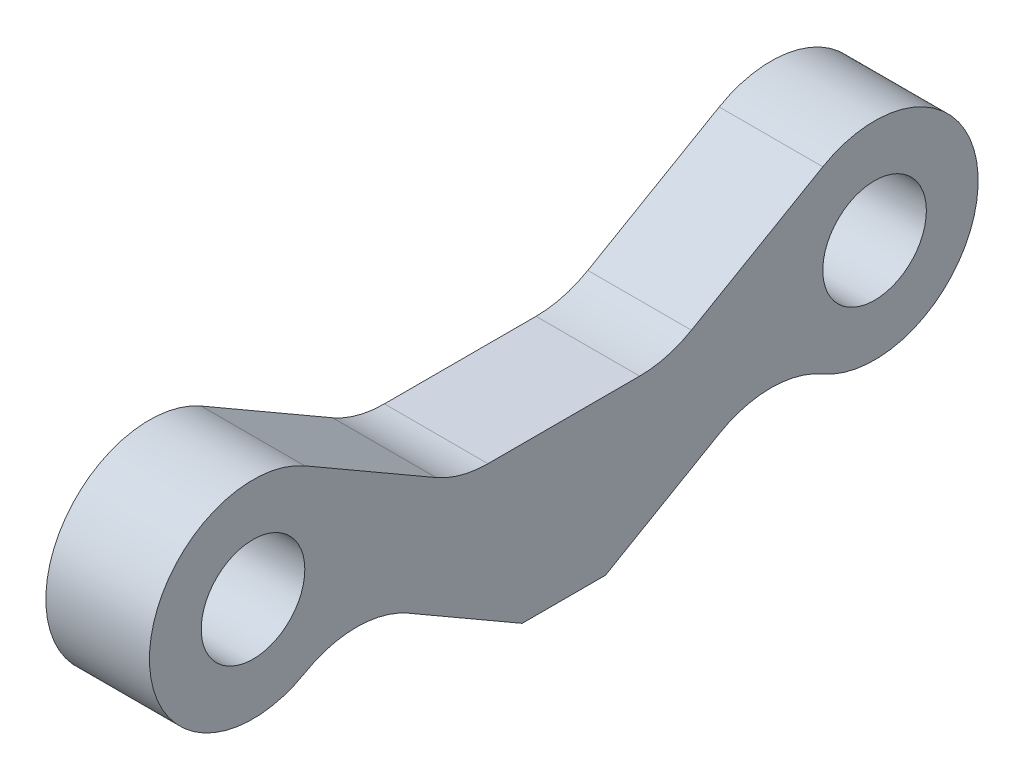
ISO-10303-21;
HEADER;
FILE_DESCRIPTION(('STEP AP214'),'2;1');
FILE_NAME('part.step','',(''),(''),'','','');
FILE_SCHEMA(('AUTOMOTIVE_DESIGN { 1 0 10303 214 1 1 1 1 }'));
ENDSEC;
DATA;
#1=APPLICATION_CONTEXT('core data for automotive mechanical design processes');
#2=APPLICATION_PROTOCOL_DEFINITION('international standard','automotive_design',2000,#1);
#3=PRODUCT_CONTEXT('',#1,'mechanical');
#4=PRODUCT('Part','Part','',(#3));
#5=PRODUCT_RELATED_PRODUCT_CATEGORY('part','',(#4));
#6=PRODUCT_DEFINITION_FORMATION('','',#4);
#7=PRODUCT_DEFINITION_CONTEXT('part definition',#1,'design');
#8=PRODUCT_DEFINITION('design','',#6,#7);
#9=PRODUCT_DEFINITION_SHAPE('','',#8);
#10=(LENGTH_UNIT() NAMED_UNIT(*) SI_UNIT(.MILLI.,.METRE.));
#11=(NAMED_UNIT(*) PLANE_ANGLE_UNIT() SI_UNIT($,.RADIAN.));
#12=(NAMED_UNIT(*) SI_UNIT($,.STERADIAN.) SOLID_ANGLE_UNIT());
#13=UNCERTAINTY_MEASURE_WITH_UNIT(LENGTH_MEASURE(1.E-05),#10,'distance_accuracy_value','');
#14=(GEOMETRIC_REPRESENTATION_CONTEXT(3) GLOBAL_UNCERTAINTY_ASSIGNED_CONTEXT((#13)) GLOBAL_UNIT_ASSIGNED_CONTEXT((#10,
#11,#12)) REPRESENTATION_CONTEXT('',''));
#15=CARTESIAN_POINT('',(0.,0.,0.));
#16=DIRECTION('',(0.,0.,1.));
#17=DIRECTION('',(1.,0.,0.));
#18=AXIS2_PLACEMENT_3D('',#15,#16,#17);
#19=CARTESIAN_POINT('',(2.,4.82842712474617,7.36432550960845));
#20=DIRECTION('',(-1.,0.,0.));
#21=DIRECTION('',(0.,0.,1.));
#22=AXIS2_PLACEMENT_3D('',#19,#20,#21);
#23=CYLINDRICAL_SURFACE('',#22,2.);
#24=CARTESIAN_POINT('',(0.,4.82842712474617,7.36432550960845));
#25=DIRECTION('',(1.,0.,0.));
#26=DIRECTION('',(0.,0.,-1.));
#27=AXIS2_PLACEMENT_3D('',#24,#25,#26);
#28=CIRCLE('',#27,2.);
#29=CARTESIAN_POINT('',(0.,2.82842712474617,7.36432550960845));
#30=VERTEX_POINT('',#29);
#31=CARTESIAN_POINT('',(0.,3.0963763171773,6.36432550960845));
#32=VERTEX_POINT('',#31);
#33=EDGE_CURVE('E165',#30,#32,#28,.T.);
#34=ORIENTED_EDGE('',*,*,#33,.F.);
#35=DIRECTION('',(-1.,0.,0.));
#36=VECTOR('',#35,1.);
#37=CARTESIAN_POINT('',(2.,2.82842712474617,7.36432550960845));
#38=LINE('',#37,#36);
#39=CARTESIAN_POINT('',(2.,2.82842712474617,7.36432550960845));
#40=VERTEX_POINT('',#39);
#41=EDGE_CURVE('E11',#40,#30,#38,.T.);
#42=ORIENTED_EDGE('',*,*,#41,.F.);
#43=CARTESIAN_POINT('',(2.,4.82842712474617,7.36432550960845));
#44=DIRECTION('',(1.,0.,0.));
#45=DIRECTION('',(0.,0.,-1.));
#46=AXIS2_PLACEMENT_3D('',#43,#44,#45);
#47=CIRCLE('',#46,2.);
#48=CARTESIAN_POINT('',(2.,3.0963763171773,6.36432550960845));
#49=VERTEX_POINT('',#48);
#50=EDGE_CURVE('E201',#40,#49,#47,.T.);
#51=ORIENTED_EDGE('',*,*,#50,.T.);
#52=DIRECTION('',(-1.,0.,0.));
#53=VECTOR('',#52,1.);
#54=CARTESIAN_POINT('',(2.,3.0963763171773,6.36432550960845));
#55=LINE('',#54,#53);
#56=EDGE_CURVE('E56',#49,#32,#55,.T.);
#57=ORIENTED_EDGE('',*,*,#56,.T.);
#58=EDGE_LOOP('',(#34,#42,#51,#57));
#59=FACE_BOUND('',#58,.T.);
#60=ADVANCED_FACE('F40',(#59),#23,.F.);
#61=CARTESIAN_POINT('',(2.,2.82842712474617,0.));
#62=DIRECTION('',(0.,1.,0.));
#63=DIRECTION('',(0.,0.,1.));
#64=AXIS2_PLACEMENT_3D('',#61,#62,#63);
#65=PLANE('',#64);
#66=DIRECTION('',(0.,0.,-1.));
#67=VECTOR('',#66,1.);
#68=CARTESIAN_POINT('',(0.,2.82842712474617,0.));
#69=LINE('',#68,#67);
#70=CARTESIAN_POINT('',(0.,2.82842712474617,10.292528739884));
#71=VERTEX_POINT('',#70);
#72=EDGE_CURVE('E167',#71,#30,#69,.T.);
#73=ORIENTED_EDGE('',*,*,#72,.F.);
#74=DIRECTION('',(-1.,0.,0.));
#75=VECTOR('',#74,1.);
#76=CARTESIAN_POINT('',(2.,2.82842712474617,10.292528739884));
#77=LINE('',#76,#75);
#78=CARTESIAN_POINT('',(2.,2.82842712474617,10.292528739884));
#79=VERTEX_POINT('',#78);
#80=EDGE_CURVE('E48',#79,#71,#77,.T.);
#81=ORIENTED_EDGE('',*,*,#80,.F.);
#82=DIRECTION('',(0.,0.,-1.));
#83=VECTOR('',#82,1.);
#84=CARTESIAN_POINT('',(2.,2.82842712474617,0.));
#85=LINE('',#84,#83);
#86=EDGE_CURVE('E240',#79,#40,#85,.T.);
#87=ORIENTED_EDGE('',*,*,#86,.T.);
#88=ORIENTED_EDGE('',*,*,#41,.T.);
#89=EDGE_LOOP('',(#73,#81,#87,#88));
#90=FACE_BOUND('',#89,.T.);
#91=ADVANCED_FACE('F228',(#90),#65,.T.);
#92=CARTESIAN_POINT('',(2.,4.82842712474617,10.292528739884));
#93=DIRECTION('',(-1.,0.,0.));
#94=DIRECTION('',(0.,0.,1.));
#95=AXIS2_PLACEMENT_3D('',#92,#93,#94);
#96=CYLINDRICAL_SURFACE('',#95,2.);
#97=CARTESIAN_POINT('',(0.,4.82842712474617,10.292528739884));
#98=DIRECTION('',(1.,0.,0.));
#99=DIRECTION('',(0.,0.,-1.));
#100=AXIS2_PLACEMENT_3D('',#97,#98,#99);
#101=CIRCLE('',#100,2.);
#102=CARTESIAN_POINT('',(0.,3.0963763171773,11.292528739884));
#103=VERTEX_POINT('',#102);
#104=EDGE_CURVE('E170',#103,#71,#101,.T.);
#105=ORIENTED_EDGE('',*,*,#104,.F.);
#106=DIRECTION('',(-1.,0.,0.));
#107=VECTOR('',#106,1.);
#108=CARTESIAN_POINT('',(2.,3.0963763171773,11.292528739884));
#109=LINE('',#108,#107);
#110=CARTESIAN_POINT('',(2.,3.0963763171773,11.292528739884));
#111=VERTEX_POINT('',#110);
#112=EDGE_CURVE('E217',#111,#103,#109,.T.);
#113=ORIENTED_EDGE('',*,*,#112,.F.);
#114=CARTESIAN_POINT('',(2.,4.82842712474617,10.292528739884));
#115=DIRECTION('',(1.,0.,0.));
#116=DIRECTION('',(0.,0.,-1.));
#117=AXIS2_PLACEMENT_3D('',#114,#115,#116);
#118=CIRCLE('',#117,2.);
#119=EDGE_CURVE('E224',#111,#79,#118,.T.);
#120=ORIENTED_EDGE('',*,*,#119,.T.);
#121=ORIENTED_EDGE('',*,*,#80,.T.);
#122=EDGE_LOOP('',(#105,#113,#120,#121));
#123=FACE_BOUND('',#122,.T.);
#124=ADVANCED_FACE('F222',(#123),#96,.F.);
#125=CARTESIAN_POINT('',(2.,-2.56752614296974,1.48236190979498));
#126=DIRECTION('',(0.,0.866025403784438,-0.500000000000001));
#127=DIRECTION('',(0.,0.500000000000001,0.866025403784438));
#128=AXIS2_PLACEMENT_3D('',#125,#126,#127);
#129=PLANE('',#128);
#130=DIRECTION('',(0.,-0.500000000000001,-0.866025403784438));
#131=VECTOR('',#130,1.);
#132=CARTESIAN_POINT('',(0.,-2.56752614296974,1.48236190979498));
#133=LINE('',#132,#131);
#134=CARTESIAN_POINT('',(0.,4.56047793231505,13.8284271247462));
#135=VERTEX_POINT('',#134);
#136=EDGE_CURVE('E173',#135,#103,#133,.T.);
#137=ORIENTED_EDGE('',*,*,#136,.F.);
#138=DIRECTION('',(-1.,0.,0.));
#139=VECTOR('',#138,1.);
#140=CARTESIAN_POINT('',(2.,4.56047793231505,13.8284271247462));
#141=LINE('',#140,#139);
#142=CARTESIAN_POINT('',(2.,4.56047793231505,13.8284271247462));
#143=VERTEX_POINT('',#142);
#144=EDGE_CURVE('E215',#143,#135,#141,.T.);
#145=ORIENTED_EDGE('',*,*,#144,.F.);
#146=DIRECTION('',(0.,-0.500000000000001,-0.866025403784438));
#147=VECTOR('',#146,1.);
#148=CARTESIAN_POINT('',(2.,-2.56752614296974,1.48236190979498));
#149=LINE('',#148,#147);
#150=EDGE_CURVE('E239',#143,#111,#149,.T.);
#151=ORIENTED_EDGE('',*,*,#150,.T.);
#152=ORIENTED_EDGE('',*,*,#112,.T.);
#153=EDGE_LOOP('',(#137,#145,#151,#152));
#154=FACE_BOUND('',#153,.T.);
#155=ADVANCED_FACE('F235',(#154),#129,.T.);
#156=CARTESIAN_POINT('',(2.,2.82842712474617,14.8284271247462));
#157=DIRECTION('',(-1.,0.,0.));
#158=DIRECTION('',(0.,0.,1.));
#159=AXIS2_PLACEMENT_3D('',#156,#157,#158);
#160=CYLINDRICAL_SURFACE('',#159,2.);
#161=CARTESIAN_POINT('',(0.,2.82842712474617,14.8284271247462));
#162=DIRECTION('',(1.,0.,0.));
#163=DIRECTION('',(0.,0.,-1.));
#164=AXIS2_PLACEMENT_3D('',#161,#162,#163);
#165=CIRCLE('',#164,2.);
#166=CARTESIAN_POINT('',(0.,1.0963763171773,13.8284271247462));
#167=VERTEX_POINT('',#166);
#168=EDGE_CURVE('E176',#135,#167,#165,.T.);
#169=ORIENTED_EDGE('',*,*,#168,.T.);
#170=DIRECTION('',(-1.,0.,0.));
#171=VECTOR('',#170,1.);
#172=CARTESIAN_POINT('',(2.,1.0963763171773,13.8284271247462));
#173=LINE('',#172,#171);
#174=CARTESIAN_POINT('',(2.,1.0963763171773,13.8284271247462));
#175=VERTEX_POINT('',#174);
#176=EDGE_CURVE('E213',#175,#167,#173,.T.);
#177=ORIENTED_EDGE('',*,*,#176,.F.);
#178=CARTESIAN_POINT('',(2.,2.82842712474617,14.8284271247462));
#179=DIRECTION('',(1.,0.,0.));
#180=DIRECTION('',(0.,0.,-1.));
#181=AXIS2_PLACEMENT_3D('',#178,#179,#180);
#182=CIRCLE('',#181,2.);
#183=EDGE_CURVE('E242',#143,#175,#182,.T.);
#184=ORIENTED_EDGE('',*,*,#183,.F.);
#185=ORIENTED_EDGE('',*,*,#144,.T.);
#186=EDGE_LOOP('',(#169,#177,#184,#185));
#187=FACE_BOUND('',#186,.T.);
#188=ADVANCED_FACE('F288',(#187),#160,.T.);
#189=CARTESIAN_POINT('',(2.,-0.635674490391583,12.8284271247462));
#190=DIRECTION('',(-1.,0.,0.));
#191=DIRECTION('',(0.,0.,1.));
#192=AXIS2_PLACEMENT_3D('',#189,#190,#191);
#193=CYLINDRICAL_SURFACE('',#192,2.);
#194=CARTESIAN_POINT('',(0.,-0.635674490391583,12.8284271247462));
#195=DIRECTION('',(1.,0.,0.));
#196=DIRECTION('',(0.,0.,-1.));
#197=AXIS2_PLACEMENT_3D('',#194,#195,#196);
#198=CIRCLE('',#197,2.);
#199=CARTESIAN_POINT('',(0.,1.09637631717729,11.8284271247462));
#200=VERTEX_POINT('',#199);
#201=EDGE_CURVE('E179',#200,#167,#198,.T.);
#202=ORIENTED_EDGE('',*,*,#201,.F.);
#203=DIRECTION('',(-1.,0.,0.));
#204=VECTOR('',#203,1.);
#205=CARTESIAN_POINT('',(2.,1.09637631717729,11.8284271247462));
#206=LINE('',#205,#204);
#207=CARTESIAN_POINT('',(2.,1.09637631717729,11.8284271247462));
#208=VERTEX_POINT('',#207);
#209=EDGE_CURVE('E211',#208,#200,#206,.T.);
#210=ORIENTED_EDGE('',*,*,#209,.F.);
#211=CARTESIAN_POINT('',(2.,-0.635674490391583,12.8284271247462));
#212=DIRECTION('',(1.,0.,0.));
#213=DIRECTION('',(0.,0.,-1.));
#214=AXIS2_PLACEMENT_3D('',#211,#212,#213);
#215=CIRCLE('',#214,2.);
#216=EDGE_CURVE('E248',#208,#175,#215,.T.);
#217=ORIENTED_EDGE('',*,*,#216,.T.);
#218=ORIENTED_EDGE('',*,*,#176,.T.);
#219=EDGE_LOOP('',(#202,#210,#217,#218));
#220=FACE_BOUND('',#219,.T.);
#221=ADVANCED_FACE('F291',(#220),#193,.F.);
#222=CARTESIAN_POINT('',(2.,-4.29957695053861,2.48236190979499));
#223=DIRECTION('',(0.,0.866025403784438,-0.500000000000001));
#224=DIRECTION('',(0.,0.500000000000001,0.866025403784438));
#225=AXIS2_PLACEMENT_3D('',#222,#223,#224);
#226=PLANE('',#225);
#227=DIRECTION('',(0.,-0.500000000000001,-0.866025403784438));
#228=VECTOR('',#227,1.);
#229=CARTESIAN_POINT('',(0.,-4.29957695053861,2.48236190979499));
#230=LINE('',#229,#228);
#231=CARTESIAN_POINT('',(0.,-0.171572875253826,9.63227470203959));
#232=VERTEX_POINT('',#231);
#233=EDGE_CURVE('E182',#200,#232,#230,.T.);
#234=ORIENTED_EDGE('',*,*,#233,.T.);
#235=DIRECTION('',(-1.,0.,0.));
#236=VECTOR('',#235,1.);
#237=CARTESIAN_POINT('',(2.,-0.171572875253826,9.63227470203959));
#238=LINE('',#237,#236);
#239=CARTESIAN_POINT('',(2.,-0.171572875253826,9.63227470203959));
#240=VERTEX_POINT('',#239);
#241=EDGE_CURVE('E208',#240,#232,#238,.T.);
#242=ORIENTED_EDGE('',*,*,#241,.F.);
#243=DIRECTION('',(0.,-0.500000000000001,-0.866025403784438));
#244=VECTOR('',#243,1.);
#245=CARTESIAN_POINT('',(2.,-4.29957695053861,2.48236190979499));
#246=LINE('',#245,#244);
#247=EDGE_CURVE('E251',#208,#240,#246,.T.);
#248=ORIENTED_EDGE('',*,*,#247,.F.);
#249=ORIENTED_EDGE('',*,*,#209,.T.);
#250=EDGE_LOOP('',(#234,#242,#248,#249));
#251=FACE_BOUND('',#250,.T.);
#252=ADVANCED_FACE('F295',(#251),#226,.F.);
#253=CARTESIAN_POINT('',(2.,-0.171572875253826,0.));
#254=DIRECTION('',(0.,1.,0.));
#255=DIRECTION('',(0.,0.,1.));
#256=AXIS2_PLACEMENT_3D('',#253,#254,#255);
#257=PLANE('',#256);
#258=DIRECTION('',(0.,0.,-1.));
#259=VECTOR('',#258,1.);
#260=CARTESIAN_POINT('',(0.,-0.171572875253826,0.));
#261=LINE('',#260,#259);
#262=CARTESIAN_POINT('',(0.,-0.171572875253826,8.02457954745283));
#263=VERTEX_POINT('',#262);
#264=EDGE_CURVE('E184',#232,#263,#261,.T.);
#265=ORIENTED_EDGE('',*,*,#264,.T.);
#266=DIRECTION('',(-1.,0.,0.));
#267=VECTOR('',#266,1.);
#268=CARTESIAN_POINT('',(2.,-0.171572875253826,8.02457954745283));
#269=LINE('',#268,#267);
#270=CARTESIAN_POINT('',(2.,-0.171572875253826,8.02457954745283));
#271=VERTEX_POINT('',#270);
#272=EDGE_CURVE('E205',#271,#263,#269,.T.);
#273=ORIENTED_EDGE('',*,*,#272,.F.);
#274=DIRECTION('',(0.,0.,-1.));
#275=VECTOR('',#274,1.);
#276=CARTESIAN_POINT('',(2.,-0.171572875253826,0.));
#277=LINE('',#276,#275);
#278=EDGE_CURVE('E154',#240,#271,#277,.T.);
#279=ORIENTED_EDGE('',*,*,#278,.F.);
#280=ORIENTED_EDGE('',*,*,#241,.T.);
#281=EDGE_LOOP('',(#265,#273,#279,#280));
#282=FACE_BOUND('',#281,.T.);
#283=ADVANCED_FACE('F258',(#282),#257,.F.);
#284=CARTESIAN_POINT('',(2.,3.34606521495123,1.93185165257814));
#285=DIRECTION('',(0.,0.866025403784438,0.500000000000001));
#286=DIRECTION('',(0.,-0.500000000000001,0.866025403784438));
#287=AXIS2_PLACEMENT_3D('',#284,#285,#286);
#288=PLANE('',#287);
#289=DIRECTION('',(0.,0.500000000000001,-0.866025403784438));
#290=VECTOR('',#289,1.);
#291=CARTESIAN_POINT('',(0.,3.34606521495123,1.93185165257814));
#292=LINE('',#291,#290);
#293=CARTESIAN_POINT('',(0.,1.0963763171773,5.82842712474619));
#294=VERTEX_POINT('',#293);
#295=EDGE_CURVE('E186',#263,#294,#292,.T.);
#296=ORIENTED_EDGE('',*,*,#295,.T.);
#297=DIRECTION('',(-1.,0.,0.));
#298=VECTOR('',#297,1.);
#299=CARTESIAN_POINT('',(2.,1.0963763171773,5.82842712474619));
#300=LINE('',#299,#298);
#301=CARTESIAN_POINT('',(2.,1.0963763171773,5.82842712474619));
#302=VERTEX_POINT('',#301);
#303=EDGE_CURVE('E140',#302,#294,#300,.T.);
#304=ORIENTED_EDGE('',*,*,#303,.F.);
#305=DIRECTION('',(0.,0.500000000000001,-0.866025403784438));
#306=VECTOR('',#305,1.);
#307=CARTESIAN_POINT('',(2.,3.34606521495123,1.93185165257814));
#308=LINE('',#307,#306);
#309=EDGE_CURVE('E151',#271,#302,#308,.T.);
#310=ORIENTED_EDGE('',*,*,#309,.F.);
#311=ORIENTED_EDGE('',*,*,#272,.T.);
#312=EDGE_LOOP('',(#296,#304,#310,#311));
#313=FACE_BOUND('',#312,.T.);
#314=ADVANCED_FACE('F262',(#313),#288,.F.);
#315=CARTESIAN_POINT('',(2.,-0.635674490391572,4.82842712474619));
#316=DIRECTION('',(-1.,0.,0.));
#317=DIRECTION('',(0.,0.,1.));
#318=AXIS2_PLACEMENT_3D('',#315,#316,#317);
#319=CYLINDRICAL_SURFACE('',#318,2.);
#320=CARTESIAN_POINT('',(0.,-0.635674490391572,4.82842712474619));
#321=DIRECTION('',(1.,0.,0.));
#322=DIRECTION('',(0.,0.,-1.));
#323=AXIS2_PLACEMENT_3D('',#320,#321,#322);
#324=CIRCLE('',#323,2.);
#325=CARTESIAN_POINT('',(0.,1.09637631717731,3.82842712474619));
#326=VERTEX_POINT('',#325);
#327=EDGE_CURVE('E137',#326,#294,#324,.T.);
#328=ORIENTED_EDGE('',*,*,#327,.F.);
#329=DIRECTION('',(-1.,0.,0.));
#330=VECTOR('',#329,1.);
#331=CARTESIAN_POINT('',(2.,1.09637631717731,3.82842712474619));
#332=LINE('',#331,#330);
#333=CARTESIAN_POINT('',(2.,1.09637631717731,3.82842712474619));
#334=VERTEX_POINT('',#333);
#335=EDGE_CURVE('E131',#334,#326,#332,.T.);
#336=ORIENTED_EDGE('',*,*,#335,.F.);
#337=CARTESIAN_POINT('',(2.,-0.635674490391572,4.82842712474619));
#338=DIRECTION('',(1.,0.,0.));
#339=DIRECTION('',(0.,0.,-1.));
#340=AXIS2_PLACEMENT_3D('',#337,#338,#339);
#341=CIRCLE('',#340,2.);
#342=EDGE_CURVE('E135',#334,#302,#341,.T.);
#343=ORIENTED_EDGE('',*,*,#342,.T.);
#344=ORIENTED_EDGE('',*,*,#303,.T.);
#345=EDGE_LOOP('',(#328,#336,#343,#344));
#346=FACE_BOUND('',#345,.T.);
#347=ADVANCED_FACE('F133',(#346),#319,.F.);
#348=CARTESIAN_POINT('',(2.,2.82842712474619,2.82842712474619));
#349=DIRECTION('',(-1.,0.,0.));
#350=DIRECTION('',(0.,0.,1.));
#351=AXIS2_PLACEMENT_3D('',#348,#349,#350);
#352=CYLINDRICAL_SURFACE('',#351,2.);
#353=CARTESIAN_POINT('',(0.,2.82842712474619,2.82842712474619));
#354=DIRECTION('',(1.,0.,0.));
#355=DIRECTION('',(0.,0.,-1.));
#356=AXIS2_PLACEMENT_3D('',#353,#354,#355);
#357=CIRCLE('',#356,2.);
#358=CARTESIAN_POINT('',(0.,4.56047793231506,3.8284271247462));
#359=VERTEX_POINT('',#358);
#360=EDGE_CURVE('E190',#326,#359,#357,.T.);
#361=ORIENTED_EDGE('',*,*,#360,.T.);
#362=DIRECTION('',(-1.,0.,0.));
#363=VECTOR('',#362,1.);
#364=CARTESIAN_POINT('',(2.,4.56047793231506,3.8284271247462));
#365=LINE('',#364,#363);
#366=CARTESIAN_POINT('',(2.,4.56047793231506,3.8284271247462));
#367=VERTEX_POINT('',#366);
#368=EDGE_CURVE('E94',#367,#359,#365,.T.);
#369=ORIENTED_EDGE('',*,*,#368,.F.);
#370=CARTESIAN_POINT('',(2.,2.82842712474619,2.82842712474619));
#371=DIRECTION('',(1.,0.,0.));
#372=DIRECTION('',(0.,0.,-1.));
#373=AXIS2_PLACEMENT_3D('',#370,#371,#372);
#374=CIRCLE('',#373,2.);
#375=EDGE_CURVE('E142',#334,#367,#374,.T.);
#376=ORIENTED_EDGE('',*,*,#375,.F.);
#377=ORIENTED_EDGE('',*,*,#335,.T.);
#378=EDGE_LOOP('',(#361,#369,#376,#377));
#379=FACE_BOUND('',#378,.T.);
#380=ADVANCED_FACE('F143',(#379),#352,.T.);
#381=CARTESIAN_POINT('',(2.,2.82842712474619,2.82842712474619));
#382=DIRECTION('',(-1.,0.,0.));
#383=DIRECTION('',(0.,0.,1.));
#384=AXIS2_PLACEMENT_3D('',#381,#382,#383);
#385=CYLINDRICAL_SURFACE('',#384,1.);
#386=CARTESIAN_POINT('',(2.,2.82842712474619,2.82842712474619));
#387=DIRECTION('',(1.,0.,0.));
#388=DIRECTION('',(0.,0.,-1.));
#389=AXIS2_PLACEMENT_3D('',#386,#387,#388);
#390=CIRCLE('',#389,1.);
#391=CARTESIAN_POINT('',(2.,2.82842712474619,1.82842712474619));
#392=VERTEX_POINT('',#391);
#393=EDGE_CURVE('E159',#392,#392,#390,.T.);
#394=ORIENTED_EDGE('',*,*,#393,.T.);
#395=EDGE_LOOP('',(#394));
#396=FACE_BOUND('',#395,.T.);
#397=CARTESIAN_POINT('',(0.,2.82842712474619,2.82842712474619));
#398=DIRECTION('',(1.,0.,0.));
#399=DIRECTION('',(0.,0.,-1.));
#400=AXIS2_PLACEMENT_3D('',#397,#398,#399);
#401=CIRCLE('',#400,1.);
#402=CARTESIAN_POINT('',(0.,2.82842712474619,1.82842712474619));
#403=VERTEX_POINT('',#402);
#404=EDGE_CURVE('E195',#403,#403,#401,.T.);
#405=ORIENTED_EDGE('',*,*,#404,.F.);
#406=EDGE_LOOP('',(#405));
#407=FACE_BOUND('',#406,.T.);
#408=ADVANCED_FACE('F266',(#396,#407),#385,.F.);
#409=CARTESIAN_POINT('',(2.,5.07811602252011,2.93185165257815));
#410=DIRECTION('',(0.,0.866025403784438,0.500000000000002));
#411=DIRECTION('',(0.,-0.500000000000002,0.866025403784438));
#412=AXIS2_PLACEMENT_3D('',#409,#410,#411);
#413=PLANE('',#412);
#414=DIRECTION('',(0.,0.500000000000002,-0.866025403784438));
#415=VECTOR('',#414,1.);
#416=CARTESIAN_POINT('',(0.,5.07811602252011,2.93185165257815));
#417=LINE('',#416,#415);
#418=EDGE_CURVE('E192',#32,#359,#417,.T.);
#419=ORIENTED_EDGE('',*,*,#418,.F.);
#420=ORIENTED_EDGE('',*,*,#56,.F.);
#421=DIRECTION('',(0.,0.500000000000002,-0.866025403784438));
#422=VECTOR('',#421,1.);
#423=CARTESIAN_POINT('',(2.,5.07811602252011,2.93185165257815));
#424=LINE('',#423,#422);
#425=EDGE_CURVE('E146',#49,#367,#424,.T.);
#426=ORIENTED_EDGE('',*,*,#425,.T.);
#427=ORIENTED_EDGE('',*,*,#368,.T.);
#428=EDGE_LOOP('',(#419,#420,#426,#427));
#429=FACE_BOUND('',#428,.T.);
#430=ADVANCED_FACE('F263',(#429),#413,.T.);
#431=CARTESIAN_POINT('',(2.,2.82842712474617,14.8284271247462));
#432=DIRECTION('',(-1.,0.,0.));
#433=DIRECTION('',(0.,0.,1.));
#434=AXIS2_PLACEMENT_3D('',#431,#432,#433);
#435=CYLINDRICAL_SURFACE('',#434,1.);
#436=CARTESIAN_POINT('',(2.,2.82842712474617,14.8284271247462));
#437=DIRECTION('',(1.,0.,0.));
#438=DIRECTION('',(0.,0.,-1.));
#439=AXIS2_PLACEMENT_3D('',#436,#437,#438);
#440=CIRCLE('',#439,1.);
#441=CARTESIAN_POINT('',(2.,2.82842712474617,13.8284271247462));
#442=VERTEX_POINT('',#441);
#443=EDGE_CURVE('E162',#442,#442,#440,.T.);
#444=ORIENTED_EDGE('',*,*,#443,.T.);
#445=EDGE_LOOP('',(#444));
#446=FACE_BOUND('',#445,.T.);
#447=CARTESIAN_POINT('',(0.,2.82842712474617,14.8284271247462));
#448=DIRECTION('',(1.,0.,0.));
#449=DIRECTION('',(0.,0.,-1.));
#450=AXIS2_PLACEMENT_3D('',#447,#448,#449);
#451=CIRCLE('',#450,1.);
#452=CARTESIAN_POINT('',(0.,2.82842712474617,13.8284271247462));
#453=VERTEX_POINT('',#452);
#454=EDGE_CURVE('E198',#453,#453,#451,.T.);
#455=ORIENTED_EDGE('',*,*,#454,.F.);
#456=EDGE_LOOP('',(#455));
#457=FACE_BOUND('',#456,.T.);
#458=ADVANCED_FACE('F265',(#446,#457),#435,.F.);
#459=CARTESIAN_POINT('',(2.,0.,0.));
#460=DIRECTION('',(1.,0.,0.));
#461=DIRECTION('',(0.,0.,-1.));
#462=AXIS2_PLACEMENT_3D('',#459,#460,#461);
#463=PLANE('',#462);
#464=ORIENTED_EDGE('',*,*,#50,.F.);
#465=ORIENTED_EDGE('',*,*,#86,.F.);
#466=ORIENTED_EDGE('',*,*,#119,.F.);
#467=ORIENTED_EDGE('',*,*,#150,.F.);
#468=ORIENTED_EDGE('',*,*,#183,.T.);
#469=ORIENTED_EDGE('',*,*,#216,.F.);
#470=ORIENTED_EDGE('',*,*,#247,.T.);
#471=ORIENTED_EDGE('',*,*,#278,.T.);
#472=ORIENTED_EDGE('',*,*,#309,.T.);
#473=ORIENTED_EDGE('',*,*,#342,.F.);
#474=ORIENTED_EDGE('',*,*,#375,.T.);
#475=ORIENTED_EDGE('',*,*,#425,.F.);
#476=EDGE_LOOP('',(#464,#465,#466,#467,#468,#469,#470,#471,#472,#473,#474,#475));
#477=FACE_BOUND('',#476,.T.);
#478=ORIENTED_EDGE('',*,*,#393,.F.);
#479=EDGE_LOOP('',(#478));
#480=FACE_BOUND('',#479,.T.);
#481=ORIENTED_EDGE('',*,*,#443,.F.);
#482=EDGE_LOOP('',(#481));
#483=FACE_BOUND('',#482,.T.);
#484=ADVANCED_FACE('F148',(#477,#480,#483),#463,.T.);
#485=CARTESIAN_POINT('',(0.,0.,0.));
#486=DIRECTION('',(1.,0.,0.));
#487=DIRECTION('',(0.,0.,-1.));
#488=AXIS2_PLACEMENT_3D('',#485,#486,#487);
#489=PLANE('',#488);
#490=ORIENTED_EDGE('',*,*,#33,.T.);
#491=ORIENTED_EDGE('',*,*,#418,.T.);
#492=ORIENTED_EDGE('',*,*,#360,.F.);
#493=ORIENTED_EDGE('',*,*,#327,.T.);
#494=ORIENTED_EDGE('',*,*,#295,.F.);
#495=ORIENTED_EDGE('',*,*,#264,.F.);
#496=ORIENTED_EDGE('',*,*,#233,.F.);
#497=ORIENTED_EDGE('',*,*,#201,.T.);
#498=ORIENTED_EDGE('',*,*,#168,.F.);
#499=ORIENTED_EDGE('',*,*,#136,.T.);
#500=ORIENTED_EDGE('',*,*,#104,.T.);
#501=ORIENTED_EDGE('',*,*,#72,.T.);
#502=EDGE_LOOP('',(#490,#491,#492,#493,#494,#495,#496,#497,#498,#499,#500,#501));
#503=FACE_BOUND('',#502,.T.);
#504=ORIENTED_EDGE('',*,*,#404,.T.);
#505=EDGE_LOOP('',(#504));
#506=FACE_BOUND('',#505,.T.);
#507=ORIENTED_EDGE('',*,*,#454,.T.);
#508=EDGE_LOOP('',(#507));
#509=FACE_BOUND('',#508,.T.);
#510=ADVANCED_FACE('F230',(#503,#506,#509),#489,.F.);
#511=CLOSED_SHELL('',(#60,#91,#124,#155,#188,#221,#252,#283,#314,#347,#380,#408,#430,#458,#484,#510));
#512=MANIFOLD_SOLID_BREP('B2',#511);
#513=ADVANCED_BREP_SHAPE_REPRESENTATION('',(#18,#512),#14);
#514=SHAPE_DEFINITION_REPRESENTATION(#9,#513);
ENDSEC;
END-ISO-10303-21;
